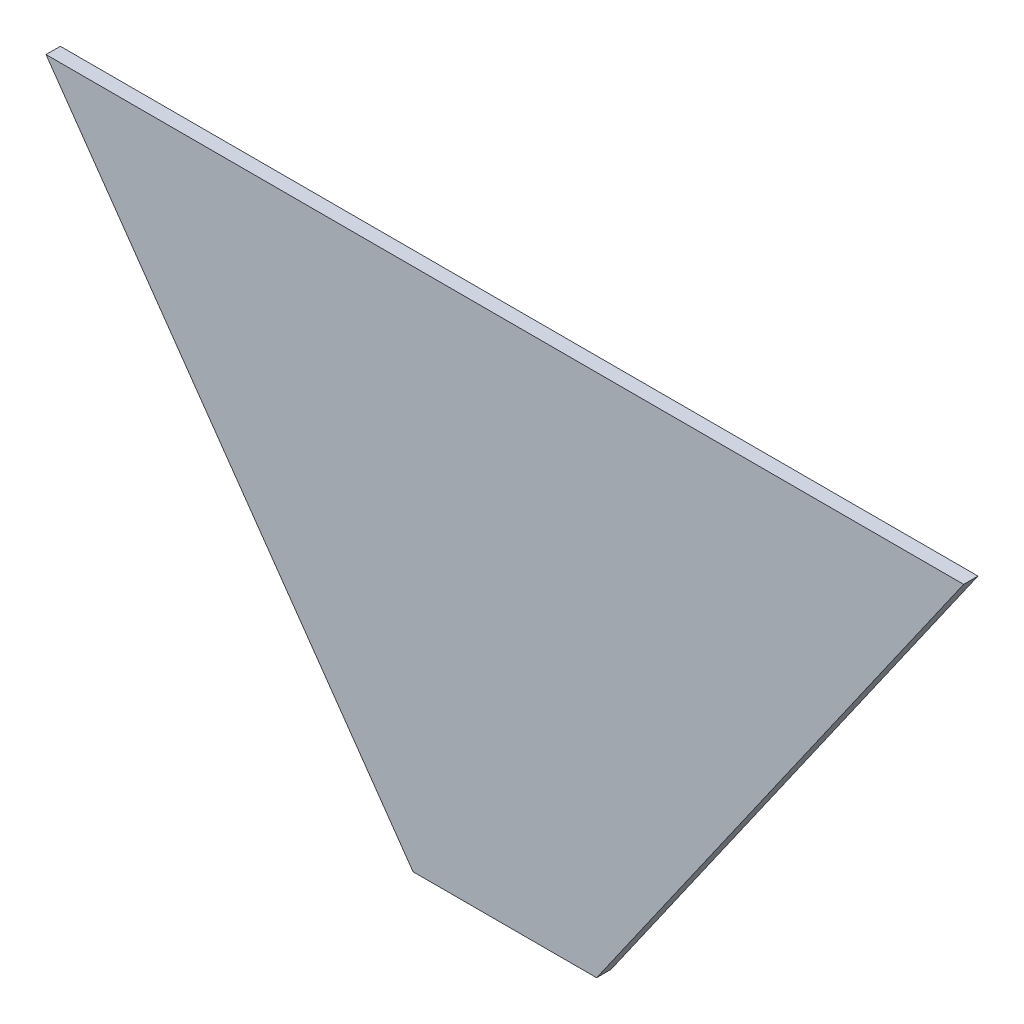
ISO-10303-21;
HEADER;
FILE_DESCRIPTION(('STEP AP214'),'2;1');
FILE_NAME('part.step','',(''),(''),'','','');
FILE_SCHEMA(('AUTOMOTIVE_DESIGN { 1 0 10303 214 1 1 1 1 }'));
ENDSEC;
DATA;
#1=APPLICATION_CONTEXT('core data for automotive mechanical design processes');
#2=APPLICATION_PROTOCOL_DEFINITION('international standard','automotive_design',2000,#1);
#3=PRODUCT_CONTEXT('',#1,'mechanical');
#4=PRODUCT('Part','Part','',(#3));
#5=PRODUCT_RELATED_PRODUCT_CATEGORY('part','',(#4));
#6=PRODUCT_DEFINITION_FORMATION('','',#4);
#7=PRODUCT_DEFINITION_CONTEXT('part definition',#1,'design');
#8=PRODUCT_DEFINITION('design','',#6,#7);
#9=PRODUCT_DEFINITION_SHAPE('','',#8);
#10=(LENGTH_UNIT() NAMED_UNIT(*) SI_UNIT(.MILLI.,.METRE.));
#11=(NAMED_UNIT(*) PLANE_ANGLE_UNIT() SI_UNIT($,.RADIAN.));
#12=(NAMED_UNIT(*) SI_UNIT($,.STERADIAN.) SOLID_ANGLE_UNIT());
#13=UNCERTAINTY_MEASURE_WITH_UNIT(LENGTH_MEASURE(1.E-05),#10,'distance_accuracy_value','');
#14=(GEOMETRIC_REPRESENTATION_CONTEXT(3) GLOBAL_UNCERTAINTY_ASSIGNED_CONTEXT((#13)) GLOBAL_UNIT_ASSIGNED_CONTEXT((#10,
#11,#12)) REPRESENTATION_CONTEXT('',''));
#15=CARTESIAN_POINT('',(0.,0.,0.));
#16=DIRECTION('',(0.,0.,1.));
#17=DIRECTION('',(1.,0.,0.));
#18=AXIS2_PLACEMENT_3D('',#15,#16,#17);
#19=CARTESIAN_POINT('',(-10.16,0.,1.5875));
#20=DIRECTION('',(0.819152044288989,0.57357643635105,0.));
#21=DIRECTION('',(-0.57357643635105,0.819152044288989,0.));
#22=AXIS2_PLACEMENT_3D('',#19,#20,#21);
#23=PLANE('',#22);
#24=DIRECTION('',(0.57357643635105,-0.819152044288989,0.));
#25=VECTOR('',#24,1.);
#26=CARTESIAN_POINT('',(-10.16,0.,0.));
#27=LINE('',#26,#25);
#28=CARTESIAN_POINT('',(-50.8,58.039934993999,0.));
#29=VERTEX_POINT('',#28);
#30=CARTESIAN_POINT('',(-10.16,0.,0.));
#31=VERTEX_POINT('',#30);
#32=EDGE_CURVE('E96',#29,#31,#27,.T.);
#33=ORIENTED_EDGE('',*,*,#32,.T.);
#34=DIRECTION('',(0.,0.,-1.));
#35=VECTOR('',#34,1.);
#36=CARTESIAN_POINT('',(-10.16,0.,1.5875));
#37=LINE('',#36,#35);
#38=CARTESIAN_POINT('',(-10.16,0.,1.5875));
#39=VERTEX_POINT('',#38);
#40=EDGE_CURVE('E11',#39,#31,#37,.T.);
#41=ORIENTED_EDGE('',*,*,#40,.F.);
#42=DIRECTION('',(0.57357643635105,-0.819152044288989,0.));
#43=VECTOR('',#42,1.);
#44=CARTESIAN_POINT('',(-10.16,0.,1.5875));
#45=LINE('',#44,#43);
#46=CARTESIAN_POINT('',(-50.8,58.039934993999,1.5875));
#47=VERTEX_POINT('',#46);
#48=EDGE_CURVE('E84',#47,#39,#45,.T.);
#49=ORIENTED_EDGE('',*,*,#48,.F.);
#50=DIRECTION('',(0.,0.,-1.));
#51=VECTOR('',#50,1.);
#52=CARTESIAN_POINT('',(-50.8,58.039934993999,1.5875));
#53=LINE('',#52,#51);
#54=EDGE_CURVE('E92',#47,#29,#53,.T.);
#55=ORIENTED_EDGE('',*,*,#54,.T.);
#56=EDGE_LOOP('',(#33,#41,#49,#55));
#57=FACE_BOUND('',#56,.T.);
#58=ADVANCED_FACE('F33',(#57),#23,.F.);
#59=CARTESIAN_POINT('',(-10.16,0.,1.5875));
#60=DIRECTION('',(0.,1.,0.));
#61=DIRECTION('',(0.,0.,1.));
#62=AXIS2_PLACEMENT_3D('',#59,#60,#61);
#63=PLANE('',#62);
#64=DIRECTION('',(1.,0.,0.));
#65=VECTOR('',#64,1.);
#66=CARTESIAN_POINT('',(-10.16,0.,0.));
#67=LINE('',#66,#65);
#68=CARTESIAN_POINT('',(10.16,0.,0.));
#69=VERTEX_POINT('',#68);
#70=EDGE_CURVE('E88',#31,#69,#67,.T.);
#71=ORIENTED_EDGE('',*,*,#70,.T.);
#72=DIRECTION('',(0.,0.,-1.));
#73=VECTOR('',#72,1.);
#74=CARTESIAN_POINT('',(10.16,0.,1.5875));
#75=LINE('',#74,#73);
#76=CARTESIAN_POINT('',(10.16,0.,1.5875));
#77=VERTEX_POINT('',#76);
#78=EDGE_CURVE('E41',#77,#69,#75,.T.);
#79=ORIENTED_EDGE('',*,*,#78,.F.);
#80=DIRECTION('',(1.,0.,0.));
#81=VECTOR('',#80,1.);
#82=CARTESIAN_POINT('',(-10.16,0.,1.5875));
#83=LINE('',#82,#81);
#84=EDGE_CURVE('E79',#39,#77,#83,.T.);
#85=ORIENTED_EDGE('',*,*,#84,.F.);
#86=ORIENTED_EDGE('',*,*,#40,.T.);
#87=EDGE_LOOP('',(#71,#79,#85,#86));
#88=FACE_BOUND('',#87,.T.);
#89=ADVANCED_FACE('F87',(#88),#63,.F.);
#90=CARTESIAN_POINT('',(50.8,58.039934993999,1.5875));
#91=DIRECTION('',(-0.819152044288989,0.57357643635105,0.));
#92=DIRECTION('',(-0.57357643635105,-0.819152044288989,0.));
#93=AXIS2_PLACEMENT_3D('',#90,#91,#92);
#94=PLANE('',#93);
#95=DIRECTION('',(0.57357643635105,0.819152044288989,0.));
#96=VECTOR('',#95,1.);
#97=CARTESIAN_POINT('',(50.8,58.039934993999,0.));
#98=LINE('',#97,#96);
#99=CARTESIAN_POINT('',(50.8,58.039934993999,0.));
#100=VERTEX_POINT('',#99);
#101=EDGE_CURVE('E66',#69,#100,#98,.T.);
#102=ORIENTED_EDGE('',*,*,#101,.T.);
#103=DIRECTION('',(0.,0.,-1.));
#104=VECTOR('',#103,1.);
#105=CARTESIAN_POINT('',(50.8,58.039934993999,1.5875));
#106=LINE('',#105,#104);
#107=CARTESIAN_POINT('',(50.8,58.039934993999,1.5875));
#108=VERTEX_POINT('',#107);
#109=EDGE_CURVE('E89',#108,#100,#106,.T.);
#110=ORIENTED_EDGE('',*,*,#109,.F.);
#111=DIRECTION('',(0.57357643635105,0.819152044288989,0.));
#112=VECTOR('',#111,1.);
#113=CARTESIAN_POINT('',(50.8,58.039934993999,1.5875));
#114=LINE('',#113,#112);
#115=EDGE_CURVE('E82',#77,#108,#114,.T.);
#116=ORIENTED_EDGE('',*,*,#115,.F.);
#117=ORIENTED_EDGE('',*,*,#78,.T.);
#118=EDGE_LOOP('',(#102,#110,#116,#117));
#119=FACE_BOUND('',#118,.T.);
#120=ADVANCED_FACE('F90',(#119),#94,.F.);
#121=CARTESIAN_POINT('',(50.8,58.039934993999,1.5875));
#122=DIRECTION('',(0.,-1.,0.));
#123=DIRECTION('',(0.,0.,-1.));
#124=AXIS2_PLACEMENT_3D('',#121,#122,#123);
#125=PLANE('',#124);
#126=DIRECTION('',(-1.,0.,0.));
#127=VECTOR('',#126,1.);
#128=CARTESIAN_POINT('',(50.8,58.039934993999,0.));
#129=LINE('',#128,#127);
#130=EDGE_CURVE('E72',#100,#29,#129,.T.);
#131=ORIENTED_EDGE('',*,*,#130,.T.);
#132=ORIENTED_EDGE('',*,*,#54,.F.);
#133=DIRECTION('',(-1.,0.,0.));
#134=VECTOR('',#133,1.);
#135=CARTESIAN_POINT('',(50.8,58.039934993999,1.5875));
#136=LINE('',#135,#134);
#137=EDGE_CURVE('E49',#108,#47,#136,.T.);
#138=ORIENTED_EDGE('',*,*,#137,.F.);
#139=ORIENTED_EDGE('',*,*,#109,.T.);
#140=EDGE_LOOP('',(#131,#132,#138,#139));
#141=FACE_BOUND('',#140,.T.);
#142=ADVANCED_FACE('F103',(#141),#125,.F.);
#143=CARTESIAN_POINT('',(0.,0.,1.5875));
#144=DIRECTION('',(0.,0.,1.));
#145=DIRECTION('',(1.,0.,0.));
#146=AXIS2_PLACEMENT_3D('',#143,#144,#145);
#147=PLANE('',#146);
#148=ORIENTED_EDGE('',*,*,#48,.T.);
#149=ORIENTED_EDGE('',*,*,#84,.T.);
#150=ORIENTED_EDGE('',*,*,#115,.T.);
#151=ORIENTED_EDGE('',*,*,#137,.T.);
#152=EDGE_LOOP('',(#148,#149,#150,#151));
#153=FACE_BOUND('',#152,.T.);
#154=ADVANCED_FACE('F80',(#153),#147,.T.);
#155=CARTESIAN_POINT('',(0.,0.,0.));
#156=DIRECTION('',(0.,0.,1.));
#157=DIRECTION('',(1.,0.,0.));
#158=AXIS2_PLACEMENT_3D('',#155,#156,#157);
#159=PLANE('',#158);
#160=ORIENTED_EDGE('',*,*,#32,.F.);
#161=ORIENTED_EDGE('',*,*,#130,.F.);
#162=ORIENTED_EDGE('',*,*,#101,.F.);
#163=ORIENTED_EDGE('',*,*,#70,.F.);
#164=EDGE_LOOP('',(#160,#161,#162,#163));
#165=FACE_BOUND('',#164,.T.);
#166=ADVANCED_FACE('F106',(#165),#159,.F.);
#167=CLOSED_SHELL('',(#58,#89,#120,#142,#154,#166));
#168=MANIFOLD_SOLID_BREP('B2',#167);
#169=ADVANCED_BREP_SHAPE_REPRESENTATION('',(#18,#168),#14);
#170=SHAPE_DEFINITION_REPRESENTATION(#9,#169);
ENDSEC;
END-ISO-10303-21;
